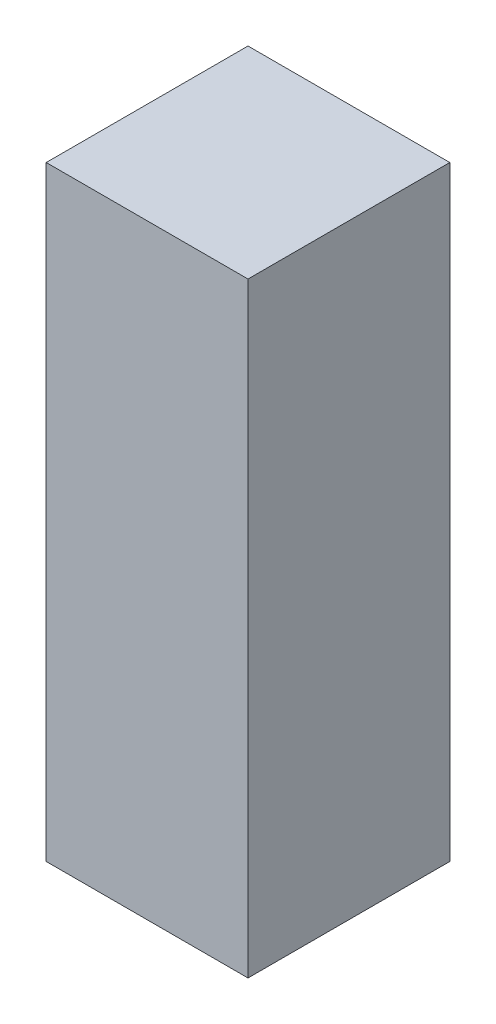
ISO-10303-21;
HEADER;
FILE_DESCRIPTION(('STEP AP214'),'2;1');
FILE_NAME('part.step','',(''),(''),'','','');
FILE_SCHEMA(('AUTOMOTIVE_DESIGN { 1 0 10303 214 1 1 1 1 }'));
ENDSEC;
DATA;
#1=APPLICATION_CONTEXT('core data for automotive mechanical design processes');
#2=APPLICATION_PROTOCOL_DEFINITION('international standard','automotive_design',2000,#1);
#3=PRODUCT_CONTEXT('',#1,'mechanical');
#4=PRODUCT('Part','Part','',(#3));
#5=PRODUCT_RELATED_PRODUCT_CATEGORY('part','',(#4));
#6=PRODUCT_DEFINITION_FORMATION('','',#4);
#7=PRODUCT_DEFINITION_CONTEXT('part definition',#1,'design');
#8=PRODUCT_DEFINITION('design','',#6,#7);
#9=PRODUCT_DEFINITION_SHAPE('','',#8);
#10=(LENGTH_UNIT() NAMED_UNIT(*) SI_UNIT(.MILLI.,.METRE.));
#11=(NAMED_UNIT(*) PLANE_ANGLE_UNIT() SI_UNIT($,.RADIAN.));
#12=(NAMED_UNIT(*) SI_UNIT($,.STERADIAN.) SOLID_ANGLE_UNIT());
#13=UNCERTAINTY_MEASURE_WITH_UNIT(LENGTH_MEASURE(1.E-05),#10,'distance_accuracy_value','');
#14=(GEOMETRIC_REPRESENTATION_CONTEXT(3) GLOBAL_UNCERTAINTY_ASSIGNED_CONTEXT((#13)) GLOBAL_UNIT_ASSIGNED_CONTEXT((#10,
#11,#12)) REPRESENTATION_CONTEXT('',''));
#15=CARTESIAN_POINT('',(0.,0.,0.));
#16=DIRECTION('',(0.,0.,1.));
#17=DIRECTION('',(1.,0.,0.));
#18=AXIS2_PLACEMENT_3D('',#15,#16,#17);
#19=CARTESIAN_POINT('',(50.8,304.8,-50.8));
#20=DIRECTION('',(-1.,0.,0.));
#21=DIRECTION('',(0.,0.,1.));
#22=AXIS2_PLACEMENT_3D('',#19,#20,#21);
#23=PLANE('',#22);
#24=DIRECTION('',(0.,0.,-1.));
#25=VECTOR('',#24,1.);
#26=CARTESIAN_POINT('',(50.8,0.,-50.8));
#27=LINE('',#26,#25);
#28=CARTESIAN_POINT('',(50.8,0.,50.8));
#29=VERTEX_POINT('',#28);
#30=CARTESIAN_POINT('',(50.8,0.,-50.8));
#31=VERTEX_POINT('',#30);
#32=EDGE_CURVE('E113',#29,#31,#27,.T.);
#33=ORIENTED_EDGE('',*,*,#32,.T.);
#34=DIRECTION('',(0.,-1.,0.));
#35=VECTOR('',#34,1.);
#36=CARTESIAN_POINT('',(50.8,304.8,-50.8));
#37=LINE('',#36,#35);
#38=CARTESIAN_POINT('',(50.8,304.8,-50.8));
#39=VERTEX_POINT('',#38);
#40=EDGE_CURVE('E11',#39,#31,#37,.T.);
#41=ORIENTED_EDGE('',*,*,#40,.F.);
#42=DIRECTION('',(0.,0.,-1.));
#43=VECTOR('',#42,1.);
#44=CARTESIAN_POINT('',(50.8,304.8,-50.8));
#45=LINE('',#44,#43);
#46=CARTESIAN_POINT('',(50.8,304.8,50.8));
#47=VERTEX_POINT('',#46);
#48=EDGE_CURVE('E97',#47,#39,#45,.T.);
#49=ORIENTED_EDGE('',*,*,#48,.F.);
#50=DIRECTION('',(0.,-1.,0.));
#51=VECTOR('',#50,1.);
#52=CARTESIAN_POINT('',(50.8,304.8,50.8));
#53=LINE('',#52,#51);
#54=EDGE_CURVE('E109',#47,#29,#53,.T.);
#55=ORIENTED_EDGE('',*,*,#54,.T.);
#56=EDGE_LOOP('',(#33,#41,#49,#55));
#57=FACE_BOUND('',#56,.T.);
#58=ADVANCED_FACE('F45',(#57),#23,.F.);
#59=CARTESIAN_POINT('',(-50.8,304.8,-50.8));
#60=DIRECTION('',(0.,0.,1.));
#61=DIRECTION('',(1.,0.,0.));
#62=AXIS2_PLACEMENT_3D('',#59,#60,#61);
#63=PLANE('',#62);
#64=DIRECTION('',(-1.,0.,0.));
#65=VECTOR('',#64,1.);
#66=CARTESIAN_POINT('',(-50.8,0.,-50.8));
#67=LINE('',#66,#65);
#68=CARTESIAN_POINT('',(-50.8,0.,-50.8));
#69=VERTEX_POINT('',#68);
#70=EDGE_CURVE('E102',#31,#69,#67,.T.);
#71=ORIENTED_EDGE('',*,*,#70,.T.);
#72=DIRECTION('',(0.,-1.,0.));
#73=VECTOR('',#72,1.);
#74=CARTESIAN_POINT('',(-50.8,304.8,-50.8));
#75=LINE('',#74,#73);
#76=CARTESIAN_POINT('',(-50.8,304.8,-50.8));
#77=VERTEX_POINT('',#76);
#78=EDGE_CURVE('E54',#77,#69,#75,.T.);
#79=ORIENTED_EDGE('',*,*,#78,.F.);
#80=DIRECTION('',(-1.,0.,0.));
#81=VECTOR('',#80,1.);
#82=CARTESIAN_POINT('',(-50.8,304.8,-50.8));
#83=LINE('',#82,#81);
#84=EDGE_CURVE('E92',#39,#77,#83,.T.);
#85=ORIENTED_EDGE('',*,*,#84,.F.);
#86=ORIENTED_EDGE('',*,*,#40,.T.);
#87=EDGE_LOOP('',(#71,#79,#85,#86));
#88=FACE_BOUND('',#87,.T.);
#89=ADVANCED_FACE('F101',(#88),#63,.F.);
#90=CARTESIAN_POINT('',(-50.8,304.8,-50.8));
#91=DIRECTION('',(1.,0.,0.));
#92=DIRECTION('',(0.,0.,-1.));
#93=AXIS2_PLACEMENT_3D('',#90,#91,#92);
#94=PLANE('',#93);
#95=DIRECTION('',(0.,0.,1.));
#96=VECTOR('',#95,1.);
#97=CARTESIAN_POINT('',(-50.8,0.,-50.8));
#98=LINE('',#97,#96);
#99=CARTESIAN_POINT('',(-50.8,0.,50.8));
#100=VERTEX_POINT('',#99);
#101=EDGE_CURVE('E79',#69,#100,#98,.T.);
#102=ORIENTED_EDGE('',*,*,#101,.T.);
#103=DIRECTION('',(0.,-1.,0.));
#104=VECTOR('',#103,1.);
#105=CARTESIAN_POINT('',(-50.8,304.8,50.8));
#106=LINE('',#105,#104);
#107=CARTESIAN_POINT('',(-50.8,304.8,50.8));
#108=VERTEX_POINT('',#107);
#109=EDGE_CURVE('E104',#108,#100,#106,.T.);
#110=ORIENTED_EDGE('',*,*,#109,.F.);
#111=DIRECTION('',(0.,0.,1.));
#112=VECTOR('',#111,1.);
#113=CARTESIAN_POINT('',(-50.8,304.8,-50.8));
#114=LINE('',#113,#112);
#115=EDGE_CURVE('E95',#77,#108,#114,.T.);
#116=ORIENTED_EDGE('',*,*,#115,.F.);
#117=ORIENTED_EDGE('',*,*,#78,.T.);
#118=EDGE_LOOP('',(#102,#110,#116,#117));
#119=FACE_BOUND('',#118,.T.);
#120=ADVANCED_FACE('F105',(#119),#94,.F.);
#121=CARTESIAN_POINT('',(-50.8,304.8,50.8));
#122=DIRECTION('',(0.,0.,-1.));
#123=DIRECTION('',(-1.,0.,0.));
#124=AXIS2_PLACEMENT_3D('',#121,#122,#123);
#125=PLANE('',#124);
#126=DIRECTION('',(1.,0.,0.));
#127=VECTOR('',#126,1.);
#128=CARTESIAN_POINT('',(-50.8,0.,50.8));
#129=LINE('',#128,#127);
#130=EDGE_CURVE('E85',#100,#29,#129,.T.);
#131=ORIENTED_EDGE('',*,*,#130,.T.);
#132=ORIENTED_EDGE('',*,*,#54,.F.);
#133=DIRECTION('',(1.,0.,0.));
#134=VECTOR('',#133,1.);
#135=CARTESIAN_POINT('',(-50.8,304.8,50.8));
#136=LINE('',#135,#134);
#137=EDGE_CURVE('E62',#108,#47,#136,.T.);
#138=ORIENTED_EDGE('',*,*,#137,.F.);
#139=ORIENTED_EDGE('',*,*,#109,.T.);
#140=EDGE_LOOP('',(#131,#132,#138,#139));
#141=FACE_BOUND('',#140,.T.);
#142=ADVANCED_FACE('F126',(#141),#125,.F.);
#143=CARTESIAN_POINT('',(0.,304.8,0.));
#144=DIRECTION('',(0.,1.,0.));
#145=DIRECTION('',(0.,0.,1.));
#146=AXIS2_PLACEMENT_3D('',#143,#144,#145);
#147=PLANE('',#146);
#148=ORIENTED_EDGE('',*,*,#48,.T.);
#149=ORIENTED_EDGE('',*,*,#84,.T.);
#150=ORIENTED_EDGE('',*,*,#115,.T.);
#151=ORIENTED_EDGE('',*,*,#137,.T.);
#152=EDGE_LOOP('',(#148,#149,#150,#151));
#153=FACE_BOUND('',#152,.T.);
#154=ADVANCED_FACE('F93',(#153),#147,.T.);
#155=CARTESIAN_POINT('',(0.,0.,0.));
#156=DIRECTION('',(0.,1.,0.));
#157=DIRECTION('',(0.,0.,1.));
#158=AXIS2_PLACEMENT_3D('',#155,#156,#157);
#159=PLANE('',#158);
#160=ORIENTED_EDGE('',*,*,#32,.F.);
#161=ORIENTED_EDGE('',*,*,#130,.F.);
#162=ORIENTED_EDGE('',*,*,#101,.F.);
#163=ORIENTED_EDGE('',*,*,#70,.F.);
#164=EDGE_LOOP('',(#160,#161,#162,#163));
#165=FACE_BOUND('',#164,.T.);
#166=ADVANCED_FACE('F129',(#165),#159,.F.);
#167=CLOSED_SHELL('',(#58,#89,#120,#142,#154,#166));
#168=MANIFOLD_SOLID_BREP('B2',#167);
#169=ADVANCED_BREP_SHAPE_REPRESENTATION('',(#18,#168),#14);
#170=SHAPE_DEFINITION_REPRESENTATION(#9,#169);
ENDSEC;
END-ISO-10303-21;
